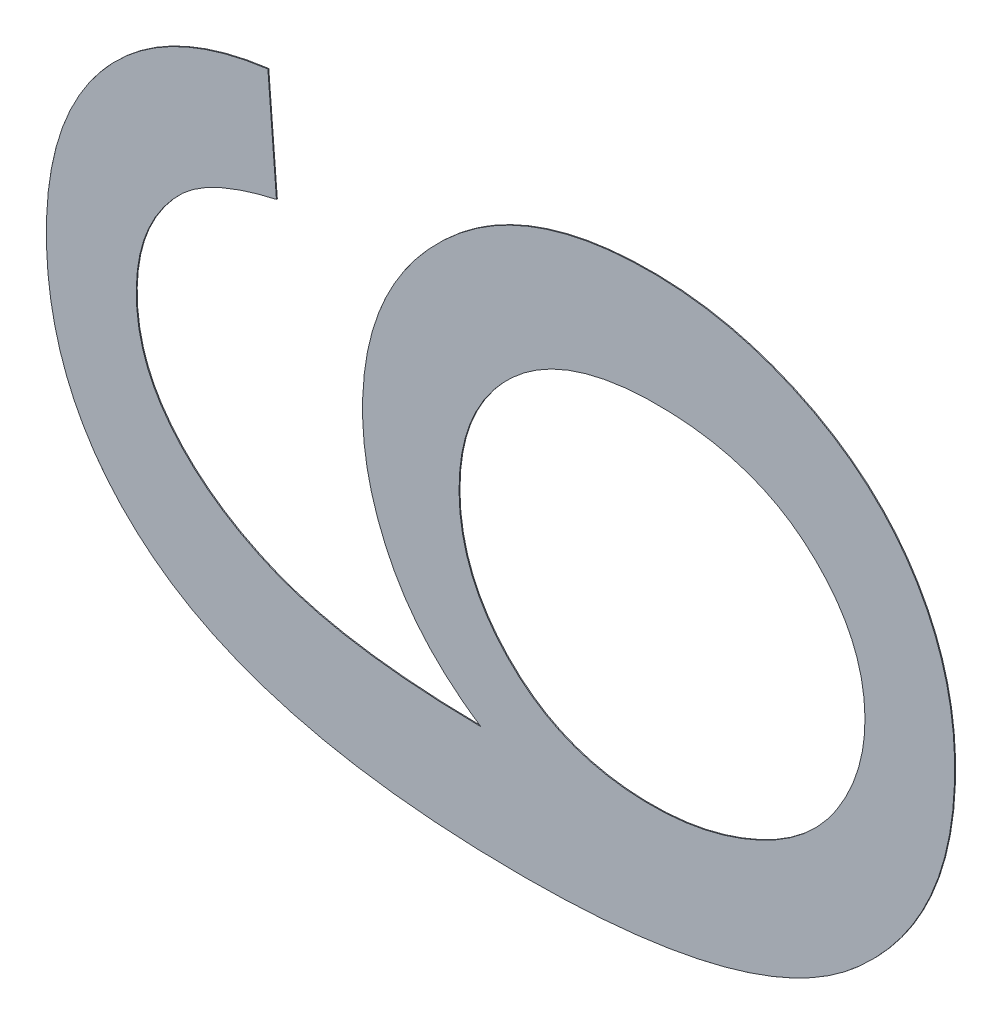
ISO-10303-21;
HEADER;
FILE_DESCRIPTION(('STEP AP214'),'2;1');
FILE_NAME('part.step','',(''),(''),'','','');
FILE_SCHEMA(('AUTOMOTIVE_DESIGN { 1 0 10303 214 1 1 1 1 }'));
ENDSEC;
DATA;
#1=APPLICATION_CONTEXT('core data for automotive mechanical design processes');
#2=APPLICATION_PROTOCOL_DEFINITION('international standard','automotive_design',2000,#1);
#3=PRODUCT_CONTEXT('',#1,'mechanical');
#4=PRODUCT('Part','Part','',(#3));
#5=PRODUCT_RELATED_PRODUCT_CATEGORY('part','',(#4));
#6=PRODUCT_DEFINITION_FORMATION('','',#4);
#7=PRODUCT_DEFINITION_CONTEXT('part definition',#1,'design');
#8=PRODUCT_DEFINITION('design','',#6,#7);
#9=PRODUCT_DEFINITION_SHAPE('','',#8);
#10=(LENGTH_UNIT() NAMED_UNIT(*) SI_UNIT(.MILLI.,.METRE.));
#11=(NAMED_UNIT(*) PLANE_ANGLE_UNIT() SI_UNIT($,.RADIAN.));
#12=(NAMED_UNIT(*) SI_UNIT($,.STERADIAN.) SOLID_ANGLE_UNIT());
#13=UNCERTAINTY_MEASURE_WITH_UNIT(LENGTH_MEASURE(1.E-05),#10,'distance_accuracy_value','');
#14=(GEOMETRIC_REPRESENTATION_CONTEXT(3) GLOBAL_UNCERTAINTY_ASSIGNED_CONTEXT((#13)) GLOBAL_UNIT_ASSIGNED_CONTEXT((#10,
#11,#12)) REPRESENTATION_CONTEXT('',''));
#15=CARTESIAN_POINT('',(0.,0.,0.));
#16=DIRECTION('',(0.,0.,1.));
#17=DIRECTION('',(1.,0.,0.));
#18=AXIS2_PLACEMENT_3D('',#15,#16,#17);
#19=CARTESIAN_POINT('',(152.494765449512,-11.3982558837351,0.002));
#20=CARTESIAN_POINT('',(152.417495395949,-11.4340290566812,0.002));
#21=CARTESIAN_POINT('',(152.336464088398,-11.4520360139146,0.002));
#22=CARTESIAN_POINT('',(152.122836095765,-11.4520360139146,0.002));
#23=CARTESIAN_POINT('',(152.018477593616,-11.4135666052795,0.002));
#24=CARTESIAN_POINT('',(151.859478741642,-11.258665661862,0.002));
#25=CARTESIAN_POINT('',(151.819582565991,-11.1647431962351,0.002));
#26=CARTESIAN_POINT('',(151.819582565991,-10.9421117249848,0.002));
#27=CARTESIAN_POINT('',(151.85927972171,-10.8492121956212,0.002));
#28=CARTESIAN_POINT('',(151.939083282177,-10.7755473705752,0.002));
#29=B_SPLINE_CURVE_WITH_KNOTS('',3,(#19,#20,#21,#22,#23,#24,#25,#26,#27,#28),.UNSPECIFIED.,.F.,
.F.,(4,2,2,2,4),(0.,0.0795440036208152,0.201562960631392,0.323905013020175,0.447149958784521),.UNSPECIFIED.);
#30=DIRECTION('',(0.,0.,-1.));
#31=VECTOR('',#30,1.);
#32=SURFACE_OF_LINEAR_EXTRUSION('',#29,#31);
#33=CARTESIAN_POINT('',(152.494765449512,-11.3982558837351,0.));
#34=CARTESIAN_POINT('',(152.417495395949,-11.4340290566812,0.));
#35=CARTESIAN_POINT('',(152.336464088398,-11.4520360139146,0.));
#36=CARTESIAN_POINT('',(152.122836095765,-11.4520360139146,0.));
#37=CARTESIAN_POINT('',(152.018477593616,-11.4135666052795,0.));
#38=CARTESIAN_POINT('',(151.859478741642,-11.258665661862,0.));
#39=CARTESIAN_POINT('',(151.819582565991,-11.1647431962351,0.));
#40=CARTESIAN_POINT('',(151.819582565991,-10.9421117249848,0.));
#41=CARTESIAN_POINT('',(151.85927972171,-10.8492121956212,0.));
#42=CARTESIAN_POINT('',(151.939083282177,-10.7755473705752,0.));
#43=B_SPLINE_CURVE_WITH_KNOTS('',3,(#33,#34,#35,#36,#37,#38,#39,#40,#41,#42),.UNSPECIFIED.,.F.,
.F.,(4,2,2,2,4),(0.,0.0795440036208152,0.201562960631392,0.323905013020175,0.447149958784521),.UNSPECIFIED.);
#44=CARTESIAN_POINT('',(152.494765449512,-11.3982558837351,0.));
#45=VERTEX_POINT('',#44);
#46=CARTESIAN_POINT('',(151.939083282177,-10.7755473705752,0.));
#47=VERTEX_POINT('',#46);
#48=EDGE_CURVE('E74',#45,#47,#43,.T.);
#49=ORIENTED_EDGE('',*,*,#48,.T.);
#50=DIRECTION('',(0.,0.,-1.));
#51=VECTOR('',#50,1.);
#52=CARTESIAN_POINT('',(151.939083282177,-10.7755473705752,0.002));
#53=LINE('',#52,#51);
#54=CARTESIAN_POINT('',(151.939083282177,-10.7755473705752,0.002));
#55=VERTEX_POINT('',#54);
#56=EDGE_CURVE('E80',#55,#47,#53,.T.);
#57=ORIENTED_EDGE('',*,*,#56,.F.);
#58=CARTESIAN_POINT('',(152.494765449512,-11.3982558837351,0.002));
#59=VERTEX_POINT('',#58);
#60=EDGE_CURVE('E85',#59,#55,#29,.T.);
#61=ORIENTED_EDGE('',*,*,#60,.F.);
#62=DIRECTION('',(0.,0.,-1.));
#63=VECTOR('',#62,1.);
#64=CARTESIAN_POINT('',(152.494765449512,-11.3982558837351,0.002));
#65=LINE('',#64,#63);
#66=EDGE_CURVE('E87',#45,#59,#65,.F.);
#67=ORIENTED_EDGE('',*,*,#66,.F.);
#68=EDGE_LOOP('',(#49,#57,#61,#67));
#69=FACE_BOUND('',#68,.T.);
#70=ADVANCED_FACE('F17',(#69),#32,.F.);
#71=CARTESIAN_POINT('',(151.409105790874,-10.6936975649685,0.002));
#72=DIRECTION('',(-0.996915363640951,-0.0784841241056481,0.));
#73=DIRECTION('',(0.0784841241056481,-0.996915363640951,0.));
#74=AXIS2_PLACEMENT_3D('',#71,#72,#73);
#75=PLANE('',#74);
#76=CARTESIAN_POINT('',(151.409105790874,-10.6936975649685,0.));
#77=CARTESIAN_POINT('',(151.402694222768,-10.6122570083898,0.));
#78=CARTESIAN_POINT('',(151.396282654662,-10.5308164518111,0.));
#79=CARTESIAN_POINT('',(151.389871086556,-10.4493758952324,0.));
#80=B_SPLINE_CURVE_WITH_KNOTS('',3,(#76,#77,#78,#79),.UNSPECIFIED.,.F.,.F.,(4,4),(0.,
0.0310015209378781),.UNSPECIFIED.);
#81=CARTESIAN_POINT('',(151.409105790874,-10.6936975649685,0.));
#82=VERTEX_POINT('',#81);
#83=CARTESIAN_POINT('',(151.389871086556,-10.4493758952324,0.));
#84=VERTEX_POINT('',#83);
#85=EDGE_CURVE('E197',#82,#84,#80,.T.);
#86=ORIENTED_EDGE('',*,*,#85,.T.);
#87=DIRECTION('',(0.,0.,-1.));
#88=VECTOR('',#87,1.);
#89=CARTESIAN_POINT('',(151.389871086556,-10.4493758952324,0.002));
#90=LINE('',#89,#88);
#91=CARTESIAN_POINT('',(151.389871086556,-10.4493758952324,0.002));
#92=VERTEX_POINT('',#91);
#93=EDGE_CURVE('E186',#92,#84,#90,.T.);
#94=ORIENTED_EDGE('',*,*,#93,.F.);
#95=CARTESIAN_POINT('',(151.409105790874,-10.6936975649685,0.002));
#96=CARTESIAN_POINT('',(151.402694222768,-10.6122570083898,0.002));
#97=CARTESIAN_POINT('',(151.396282654662,-10.5308164518111,0.002));
#98=CARTESIAN_POINT('',(151.389871086556,-10.4493758952324,0.002));
#99=B_SPLINE_CURVE_WITH_KNOTS('',3,(#95,#96,#97,#98),.UNSPECIFIED.,.F.,.F.,(4,4),(0.,
0.0310015209378781),.UNSPECIFIED.);
#100=CARTESIAN_POINT('',(151.409105790874,-10.6936975649685,0.002));
#101=VERTEX_POINT('',#100);
#102=EDGE_CURVE('E182',#101,#92,#99,.T.);
#103=ORIENTED_EDGE('',*,*,#102,.F.);
#104=DIRECTION('',(0.,0.,-1.));
#105=VECTOR('',#104,1.);
#106=CARTESIAN_POINT('',(151.409105790874,-10.6936975649685,0.002));
#107=LINE('',#106,#105);
#108=EDGE_CURVE('E171',#101,#82,#107,.T.);
#109=ORIENTED_EDGE('',*,*,#108,.T.);
#110=EDGE_LOOP('',(#86,#94,#103,#109));
#111=FACE_BOUND('',#110,.T.);
#112=ADVANCED_FACE('F112',(#111),#75,.F.);
#113=CARTESIAN_POINT('',(151.389871086556,-10.4493758952324,0.002));
#114=CARTESIAN_POINT('',(151.234356455904,-10.4694290976061,0.002));
#115=CARTESIAN_POINT('',(151.11240024555,-10.529588704727,0.002));
#116=CARTESIAN_POINT('',(150.936447896515,-10.7309109273432,0.002));
#117=CARTESIAN_POINT('',(150.89181501944,-10.859443421322,0.002));
#118=CARTESIAN_POINT('',(150.89181501944,-11.2277675465523,0.002));
#119=CARTESIAN_POINT('',(150.968344587681,-11.395559648046,0.002));
#120=CARTESIAN_POINT('',(151.296203698873,-11.6636481974115,0.002));
#121=CARTESIAN_POINT('',(151.577716390423,-11.7344178432578,0.002));
#122=CARTESIAN_POINT('',(152.309862901575,-11.7344178432578,0.002));
#123=CARTESIAN_POINT('',(152.557867812564,-11.6701657458565,0.002));
#124=CARTESIAN_POINT('',(152.859075097197,-11.4115203601393,0.002));
#125=CARTESIAN_POINT('',(152.933967669327,-11.2449560057297,0.002));
#126=CARTESIAN_POINT('',(152.933967669327,-10.920012277471,0.002));
#127=CARTESIAN_POINT('',(152.905320237364,-10.8127890321262,0.002));
#128=CARTESIAN_POINT('',(152.790730509515,-10.6237159811747,0.002));
#129=CARTESIAN_POINT('',(152.70847145488,-10.5492326580726,0.002));
#130=CARTESIAN_POINT('',(152.492715242909,-10.4413545520871,0.002));
#131=CARTESIAN_POINT('',(152.376161244117,-10.4137712297935,0.002));
#132=CARTESIAN_POINT('',(152.059811745447,-10.4137712297935,0.002));
#133=CARTESIAN_POINT('',(151.903887865767,-10.4714753427462,0.002));
#134=CARTESIAN_POINT('',(151.663035391572,-10.7016778776053,0.002));
#135=CARTESIAN_POINT('',(151.602680581133,-10.8410272150605,0.002));
#136=CARTESIAN_POINT('',(151.602680581133,-11.0984448536936,0.002));
#137=CARTESIAN_POINT('',(151.62437077962,-11.188070390833,0.002));
#138=CARTESIAN_POINT('',(151.711784146138,-11.3588123871166,0.002));
#139=CARTESIAN_POINT('',(151.778657663188,-11.4311643134849,0.002));
#140=CARTESIAN_POINT('',(151.868692449356,-11.4905054225498,0.002));
#141=B_SPLINE_CURVE_WITH_KNOTS('',3,(#113,#114,#115,#116,#117,#118,#119,#120,#121,#122,#123,
#124,#125,#126,#127,#128,#129,#130,#131,#132,#133,#134,#135,#136,#137,#138,#139,#140),
.UNSPECIFIED.,.F.,.F.,(4,2,2,2,2,2,2,2,2,2,2,2,2,4),(0.0310015209378781,0.0837800519148876,
0.136543747182128,0.207123755137009,0.288134416926642,0.360649257193854,0.433164097461057,
0.475802823538172,0.518441549615293,0.560951116522833,0.625477038929711,0.690117751787903,
0.727124559899218,0.763991143711195),.UNSPECIFIED.);
#142=DIRECTION('',(0.,0.,-1.));
#143=VECTOR('',#142,1.);
#144=SURFACE_OF_LINEAR_EXTRUSION('',#141,#143);
#145=CARTESIAN_POINT('',(151.389871086556,-10.4493758952324,0.));
#146=CARTESIAN_POINT('',(151.234356455904,-10.4694290976061,0.));
#147=CARTESIAN_POINT('',(151.11240024555,-10.529588704727,0.));
#148=CARTESIAN_POINT('',(150.936447896515,-10.7309109273432,0.));
#149=CARTESIAN_POINT('',(150.89181501944,-10.859443421322,0.));
#150=CARTESIAN_POINT('',(150.89181501944,-11.2277675465523,0.));
#151=CARTESIAN_POINT('',(150.968344587681,-11.395559648046,0.));
#152=CARTESIAN_POINT('',(151.296203698873,-11.6636481974115,0.));
#153=CARTESIAN_POINT('',(151.577716390423,-11.7344178432578,0.));
#154=CARTESIAN_POINT('',(152.309862901575,-11.7344178432578,0.));
#155=CARTESIAN_POINT('',(152.557867812564,-11.6701657458565,0.));
#156=CARTESIAN_POINT('',(152.859075097197,-11.4115203601393,0.));
#157=CARTESIAN_POINT('',(152.933967669327,-11.2449560057297,0.));
#158=CARTESIAN_POINT('',(152.933967669327,-10.920012277471,0.));
#159=CARTESIAN_POINT('',(152.905320237364,-10.8127890321262,0.));
#160=CARTESIAN_POINT('',(152.790730509515,-10.6237159811747,0.));
#161=CARTESIAN_POINT('',(152.70847145488,-10.5492326580726,0.));
#162=CARTESIAN_POINT('',(152.492715242909,-10.4413545520871,0.));
#163=CARTESIAN_POINT('',(152.376161244117,-10.4137712297935,0.));
#164=CARTESIAN_POINT('',(152.059811745447,-10.4137712297935,0.));
#165=CARTESIAN_POINT('',(151.903887865767,-10.4714753427462,0.));
#166=CARTESIAN_POINT('',(151.663035391572,-10.7016778776053,0.));
#167=CARTESIAN_POINT('',(151.602680581133,-10.8410272150605,0.));
#168=CARTESIAN_POINT('',(151.602680581133,-11.0984448536936,0.));
#169=CARTESIAN_POINT('',(151.62437077962,-11.188070390833,0.));
#170=CARTESIAN_POINT('',(151.711784146138,-11.3588123871166,0.));
#171=CARTESIAN_POINT('',(151.778657663188,-11.4311643134849,0.));
#172=CARTESIAN_POINT('',(151.868692449356,-11.4905054225498,0.));
#173=B_SPLINE_CURVE_WITH_KNOTS('',3,(#145,#146,#147,#148,#149,#150,#151,#152,#153,#154,#155,
#156,#157,#158,#159,#160,#161,#162,#163,#164,#165,#166,#167,#168,#169,#170,#171,#172),
.UNSPECIFIED.,.F.,.F.,(4,2,2,2,2,2,2,2,2,2,2,2,2,4),(0.0310015209378781,0.0837800519148876,
0.136543747182128,0.207123755137009,0.288134416926642,0.360649257193854,0.433164097461057,
0.475802823538172,0.518441549615293,0.560951116522833,0.625477038929711,0.690117751787903,
0.727124559899218,0.763991143711195),.UNSPECIFIED.);
#174=CARTESIAN_POINT('',(151.868692449356,-11.4905054225498,0.));
#175=VERTEX_POINT('',#174);
#176=EDGE_CURVE('E168',#84,#175,#173,.T.);
#177=ORIENTED_EDGE('',*,*,#176,.T.);
#178=DIRECTION('',(0.,0.,-1.));
#179=VECTOR('',#178,1.);
#180=CARTESIAN_POINT('',(151.868692449356,-11.4905054225498,0.002));
#181=LINE('',#180,#179);
#182=CARTESIAN_POINT('',(151.868692449356,-11.4905054225498,0.002));
#183=VERTEX_POINT('',#182);
#184=EDGE_CURVE('E164',#183,#175,#181,.T.);
#185=ORIENTED_EDGE('',*,*,#184,.F.);
#186=EDGE_CURVE('E154',#92,#183,#141,.T.);
#187=ORIENTED_EDGE('',*,*,#186,.F.);
#188=ORIENTED_EDGE('',*,*,#93,.T.);
#189=EDGE_LOOP('',(#177,#185,#187,#188));
#190=FACE_BOUND('',#189,.T.);
#191=ADVANCED_FACE('F115',(#190),#144,.F.);
#192=CARTESIAN_POINT('',(151.868692449356,-11.4905054225498,0.002));
#193=CARTESIAN_POINT('',(151.668569674647,-11.4884591774096,0.002));
#194=CARTESIAN_POINT('',(151.514282791079,-11.4651319828117,0.002));
#195=CARTESIAN_POINT('',(151.298055318004,-11.3766752892815,0.002));
#196=CARTESIAN_POINT('',(151.215531000614,-11.3153468385514,0.002));
#197=CARTESIAN_POINT('',(151.116180848057,-11.1782871390394,0.002));
#198=CARTESIAN_POINT('',(151.093984039288,-11.1103130755066,0.002));
#199=CARTESIAN_POINT('',(151.093984039288,-10.9347452424802,0.002));
#200=CARTESIAN_POINT('',(151.128770206671,-10.8528954368735,0.002));
#201=CARTESIAN_POINT('',(151.198751790464,-10.7865970943321,0.002));
#202=B_SPLINE_CURVE_WITH_KNOTS('',3,(#192,#193,#194,#195,#196,#197,#198,#199,#200,#201),
.UNSPECIFIED.,.F.,.F.,(4,2,2,2,4),(0.763991143711195,0.819360171106074,0.874802988312172,
0.917604073378402,0.970937362623232),.UNSPECIFIED.);
#203=DIRECTION('',(0.,0.,-1.));
#204=VECTOR('',#203,1.);
#205=SURFACE_OF_LINEAR_EXTRUSION('',#202,#204);
#206=CARTESIAN_POINT('',(151.868692449356,-11.4905054225498,0.));
#207=CARTESIAN_POINT('',(151.668569674647,-11.4884591774096,0.));
#208=CARTESIAN_POINT('',(151.514282791079,-11.4651319828117,0.));
#209=CARTESIAN_POINT('',(151.298055318004,-11.3766752892815,0.));
#210=CARTESIAN_POINT('',(151.215531000614,-11.3153468385514,0.));
#211=CARTESIAN_POINT('',(151.116180848057,-11.1782871390394,0.));
#212=CARTESIAN_POINT('',(151.093984039288,-11.1103130755066,0.));
#213=CARTESIAN_POINT('',(151.093984039288,-10.9347452424802,0.));
#214=CARTESIAN_POINT('',(151.128770206671,-10.8528954368735,0.));
#215=CARTESIAN_POINT('',(151.198751790464,-10.7865970943321,0.));
#216=B_SPLINE_CURVE_WITH_KNOTS('',3,(#206,#207,#208,#209,#210,#211,#212,#213,#214,#215),
.UNSPECIFIED.,.F.,.F.,(4,2,2,2,4),(0.763991143711195,0.819360171106074,0.874802988312172,
0.917604073378402,0.970937362623232),.UNSPECIFIED.);
#217=CARTESIAN_POINT('',(151.198751790464,-10.7865970943321,0.));
#218=VERTEX_POINT('',#217);
#219=EDGE_CURVE('E151',#175,#218,#216,.T.);
#220=ORIENTED_EDGE('',*,*,#219,.T.);
#221=DIRECTION('',(0.,0.,-1.));
#222=VECTOR('',#221,1.);
#223=CARTESIAN_POINT('',(151.198751790464,-10.7865970943321,0.002));
#224=LINE('',#223,#222);
#225=CARTESIAN_POINT('',(151.198751790464,-10.7865970943321,0.002));
#226=VERTEX_POINT('',#225);
#227=EDGE_CURVE('E143',#226,#218,#224,.T.);
#228=ORIENTED_EDGE('',*,*,#227,.F.);
#229=EDGE_CURVE('E39',#183,#226,#202,.T.);
#230=ORIENTED_EDGE('',*,*,#229,.F.);
#231=ORIENTED_EDGE('',*,*,#184,.T.);
#232=EDGE_LOOP('',(#220,#228,#230,#231));
#233=FACE_BOUND('',#232,.T.);
#234=ADVANCED_FACE('F119',(#233),#205,.F.);
#235=CARTESIAN_POINT('',(151.198751790464,-10.7865970943321,0.002));
#236=CARTESIAN_POINT('',(151.242541436464,-10.7464906895848,0.002));
#237=CARTESIAN_POINT('',(151.312523020258,-10.7153877634542,0.002));
#238=CARTESIAN_POINT('',(151.409105790874,-10.6936975649685,0.002));
#239=B_SPLINE_CURVE_WITH_KNOTS('',3,(#235,#236,#237,#238),.UNSPECIFIED.,.F.,.F.,(4,4),
(0.970937362623232,1.),.UNSPECIFIED.);
#240=DIRECTION('',(0.,0.,-1.));
#241=VECTOR('',#240,1.);
#242=SURFACE_OF_LINEAR_EXTRUSION('',#239,#241);
#243=CARTESIAN_POINT('',(151.198751790464,-10.7865970943321,0.));
#244=CARTESIAN_POINT('',(151.242541436464,-10.7464906895848,0.));
#245=CARTESIAN_POINT('',(151.312523020258,-10.7153877634542,0.));
#246=CARTESIAN_POINT('',(151.409105790874,-10.6936975649685,0.));
#247=B_SPLINE_CURVE_WITH_KNOTS('',3,(#243,#244,#245,#246),.UNSPECIFIED.,.F.,.F.,(4,4),
(0.970937362623232,1.),.UNSPECIFIED.);
#248=EDGE_CURVE('E142',#218,#82,#247,.T.);
#249=ORIENTED_EDGE('',*,*,#248,.T.);
#250=ORIENTED_EDGE('',*,*,#108,.F.);
#251=EDGE_CURVE('E77',#226,#101,#239,.T.);
#252=ORIENTED_EDGE('',*,*,#251,.F.);
#253=ORIENTED_EDGE('',*,*,#227,.T.);
#254=EDGE_LOOP('',(#249,#250,#252,#253));
#255=FACE_BOUND('',#254,.T.);
#256=ADVANCED_FACE('F123',(#255),#242,.F.);
#257=CARTESIAN_POINT('',(151.939083282177,-10.7755473705752,0.002));
#258=CARTESIAN_POINT('',(152.018666135707,-10.7020862750087,0.002));
#259=CARTESIAN_POINT('',(152.127337835073,-10.6650501330061,0.002));
#260=CARTESIAN_POINT('',(152.409310415388,-10.6650501330061,0.002));
#261=CARTESIAN_POINT('',(152.523081645181,-10.7022917945572,0.002));
#262=CARTESIAN_POINT('',(152.690283369537,-10.8514619604039,0.002));
#263=CARTESIAN_POINT('',(152.732207898506,-10.9404747288727,0.002));
#264=CARTESIAN_POINT('',(152.732207898506,-11.115224063843,0.002));
#265=CARTESIAN_POINT('',(152.712154696133,-11.1827501534686,0.002));
#266=CARTESIAN_POINT('',(152.631123388582,-11.3120728463272,0.002));
#267=CARTESIAN_POINT('',(152.572191528545,-11.3624104767753,0.002));
#268=CARTESIAN_POINT('',(152.494765449512,-11.3982558837351,0.002));
#269=B_SPLINE_CURVE_WITH_KNOTS('',3,(#257,#258,#259,#260,#261,#262,#263,#264,#265,#266,#267,
#268),.UNSPECIFIED.,.F.,.F.,(4,2,2,2,2,4),(0.447149958784521,0.570054054914793,0.69768523166548,
0.825665150260434,0.912832575130226,1.),.UNSPECIFIED.);
#270=DIRECTION('',(0.,0.,-1.));
#271=VECTOR('',#270,1.);
#272=SURFACE_OF_LINEAR_EXTRUSION('',#269,#271);
#273=CARTESIAN_POINT('',(151.939083282177,-10.7755473705752,0.));
#274=CARTESIAN_POINT('',(152.018666135707,-10.7020862750087,0.));
#275=CARTESIAN_POINT('',(152.127337835073,-10.6650501330061,0.));
#276=CARTESIAN_POINT('',(152.409310415388,-10.6650501330061,0.));
#277=CARTESIAN_POINT('',(152.523081645181,-10.7022917945572,0.));
#278=CARTESIAN_POINT('',(152.690283369537,-10.8514619604039,0.));
#279=CARTESIAN_POINT('',(152.732207898506,-10.9404747288727,0.));
#280=CARTESIAN_POINT('',(152.732207898506,-11.115224063843,0.));
#281=CARTESIAN_POINT('',(152.712154696133,-11.1827501534686,0.));
#282=CARTESIAN_POINT('',(152.631123388582,-11.3120728463272,0.));
#283=CARTESIAN_POINT('',(152.572191528545,-11.3624104767753,0.));
#284=CARTESIAN_POINT('',(152.494765449512,-11.3982558837351,0.));
#285=B_SPLINE_CURVE_WITH_KNOTS('',3,(#273,#274,#275,#276,#277,#278,#279,#280,#281,#282,#283,
#284),.UNSPECIFIED.,.F.,.F.,(4,2,2,2,2,4),(0.447149958784521,0.570054054914793,0.69768523166548,
0.825665150260434,0.912832575130226,1.),.UNSPECIFIED.);
#286=EDGE_CURVE('E30',#47,#45,#285,.T.);
#287=ORIENTED_EDGE('',*,*,#286,.T.);
#288=ORIENTED_EDGE('',*,*,#66,.T.);
#289=EDGE_CURVE('E11',#55,#59,#269,.T.);
#290=ORIENTED_EDGE('',*,*,#289,.F.);
#291=ORIENTED_EDGE('',*,*,#56,.T.);
#292=EDGE_LOOP('',(#287,#288,#290,#291));
#293=FACE_BOUND('',#292,.T.);
#294=ADVANCED_FACE('F81',(#293),#272,.F.);
#295=CARTESIAN_POINT('',(152.879512951567,-11.3147497364417,0.002));
#296=DIRECTION('',(0.,0.,-1.));
#297=DIRECTION('',(-1.,0.,0.));
#298=AXIS2_PLACEMENT_3D('',#295,#296,#297);
#299=PLANE('',#298);
#300=ORIENTED_EDGE('',*,*,#102,.T.);
#301=ORIENTED_EDGE('',*,*,#186,.T.);
#302=ORIENTED_EDGE('',*,*,#229,.T.);
#303=ORIENTED_EDGE('',*,*,#251,.T.);
#304=EDGE_LOOP('',(#300,#301,#302,#303));
#305=FACE_BOUND('',#304,.T.);
#306=ORIENTED_EDGE('',*,*,#60,.T.);
#307=ORIENTED_EDGE('',*,*,#289,.T.);
#308=EDGE_LOOP('',(#306,#307));
#309=FACE_BOUND('',#308,.T.);
#310=ADVANCED_FACE('F213',(#305,#309),#299,.F.);
#311=CARTESIAN_POINT('',(152.879512951567,-11.3147497364417,0.));
#312=DIRECTION('',(0.,0.,-1.));
#313=DIRECTION('',(-1.,0.,0.));
#314=AXIS2_PLACEMENT_3D('',#311,#312,#313);
#315=PLANE('',#314);
#316=ORIENTED_EDGE('',*,*,#85,.F.);
#317=ORIENTED_EDGE('',*,*,#248,.F.);
#318=ORIENTED_EDGE('',*,*,#219,.F.);
#319=ORIENTED_EDGE('',*,*,#176,.F.);
#320=EDGE_LOOP('',(#316,#317,#318,#319));
#321=FACE_BOUND('',#320,.T.);
#322=ORIENTED_EDGE('',*,*,#48,.F.);
#323=ORIENTED_EDGE('',*,*,#286,.F.);
#324=EDGE_LOOP('',(#322,#323));
#325=FACE_BOUND('',#324,.T.);
#326=ADVANCED_FACE('F19',(#321,#325),#315,.T.);
#327=CLOSED_SHELL('',(#70,#112,#191,#234,#256,#294,#310,#326));
#328=MANIFOLD_SOLID_BREP('B1',#327);
#329=ADVANCED_BREP_SHAPE_REPRESENTATION('',(#18,#328),#14);
#330=SHAPE_DEFINITION_REPRESENTATION(#9,#329);
ENDSEC;
END-ISO-10303-21;
